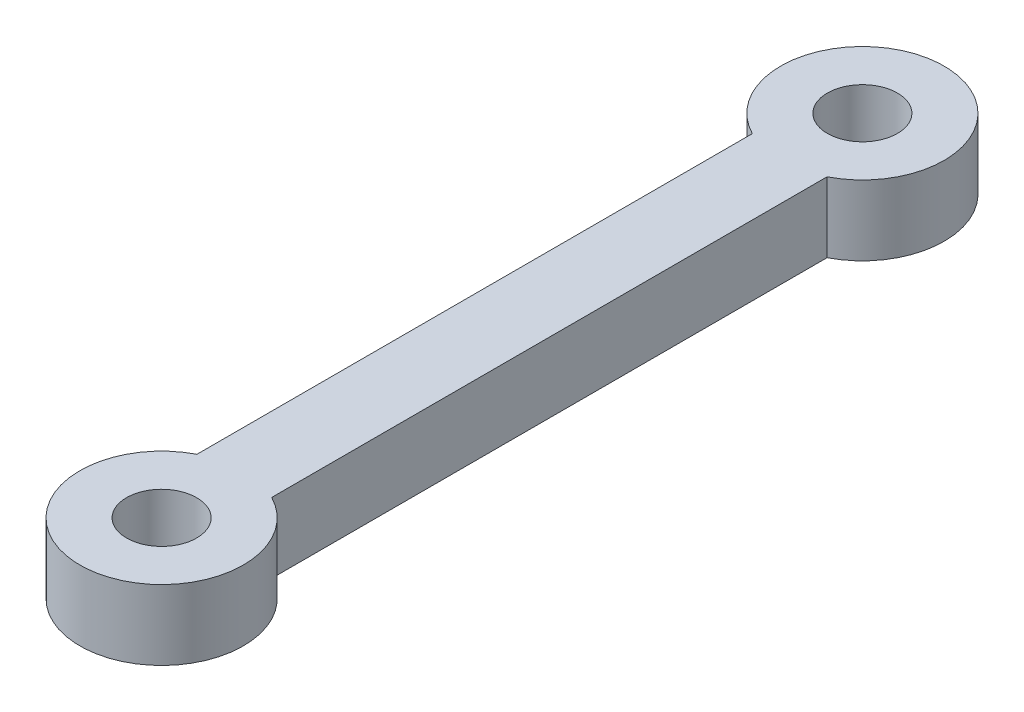
ISO-10303-21;
HEADER;
FILE_DESCRIPTION(('STEP AP214'),'2;1');
FILE_NAME('part.step','',(''),(''),'','','');
FILE_SCHEMA(('AUTOMOTIVE_DESIGN { 1 0 10303 214 1 1 1 1 }'));
ENDSEC;
DATA;
#1=APPLICATION_CONTEXT('core data for automotive mechanical design processes');
#2=APPLICATION_PROTOCOL_DEFINITION('international standard','automotive_design',2000,#1);
#3=PRODUCT_CONTEXT('',#1,'mechanical');
#4=PRODUCT('Part','Part','',(#3));
#5=PRODUCT_RELATED_PRODUCT_CATEGORY('part','',(#4));
#6=PRODUCT_DEFINITION_FORMATION('','',#4);
#7=PRODUCT_DEFINITION_CONTEXT('part definition',#1,'design');
#8=PRODUCT_DEFINITION('design','',#6,#7);
#9=PRODUCT_DEFINITION_SHAPE('','',#8);
#10=(LENGTH_UNIT() NAMED_UNIT(*) SI_UNIT(.MILLI.,.METRE.));
#11=(NAMED_UNIT(*) PLANE_ANGLE_UNIT() SI_UNIT($,.RADIAN.));
#12=(NAMED_UNIT(*) SI_UNIT($,.STERADIAN.) SOLID_ANGLE_UNIT());
#13=UNCERTAINTY_MEASURE_WITH_UNIT(LENGTH_MEASURE(1.E-05),#10,'distance_accuracy_value','');
#14=(GEOMETRIC_REPRESENTATION_CONTEXT(3) GLOBAL_UNCERTAINTY_ASSIGNED_CONTEXT((#13)) GLOBAL_UNIT_ASSIGNED_CONTEXT((#10,
#11,#12)) REPRESENTATION_CONTEXT('',''));
#15=CARTESIAN_POINT('',(0.,0.,0.));
#16=DIRECTION('',(0.,0.,1.));
#17=DIRECTION('',(1.,0.,0.));
#18=AXIS2_PLACEMENT_3D('',#15,#16,#17);
#19=CARTESIAN_POINT('',(0.,3.,0.));
#20=DIRECTION('',(0.,-1.,0.));
#21=DIRECTION('',(0.,0.,-1.));
#22=AXIS2_PLACEMENT_3D('',#19,#20,#21);
#23=CYLINDRICAL_SURFACE('',#22,3.5);
#24=CARTESIAN_POINT('',(0.,0.,0.));
#25=DIRECTION('',(0.,1.,0.));
#26=DIRECTION('',(0.,0.,1.));
#27=AXIS2_PLACEMENT_3D('',#24,#25,#26);
#28=CIRCLE('',#27,3.5);
#29=CARTESIAN_POINT('',(1.6,0.,-3.11287648325468));
#30=VERTEX_POINT('',#29);
#31=CARTESIAN_POINT('',(-1.6,0.,-3.11287648325468));
#32=VERTEX_POINT('',#31);
#33=EDGE_CURVE('E104',#30,#32,#28,.F.);
#34=ORIENTED_EDGE('',*,*,#33,.F.);
#35=DIRECTION('',(0.,-1.,0.));
#36=VECTOR('',#35,1.);
#37=CARTESIAN_POINT('',(1.6,3.,-3.11287648325468));
#38=LINE('',#37,#36);
#39=CARTESIAN_POINT('',(1.6,3.,-3.11287648325468));
#40=VERTEX_POINT('',#39);
#41=EDGE_CURVE('E11',#40,#30,#38,.T.);
#42=ORIENTED_EDGE('',*,*,#41,.F.);
#43=CARTESIAN_POINT('',(0.,3.,0.));
#44=DIRECTION('',(0.,1.,0.));
#45=DIRECTION('',(0.,0.,1.));
#46=AXIS2_PLACEMENT_3D('',#43,#44,#45);
#47=CIRCLE('',#46,3.5);
#48=CARTESIAN_POINT('',(-1.6,3.,-3.11287648325468));
#49=VERTEX_POINT('',#48);
#50=EDGE_CURVE('E90',#40,#49,#47,.F.);
#51=ORIENTED_EDGE('',*,*,#50,.T.);
#52=DIRECTION('',(0.,-1.,0.));
#53=VECTOR('',#52,1.);
#54=CARTESIAN_POINT('',(-1.6,3.,-3.11287648325468));
#55=LINE('',#54,#53);
#56=EDGE_CURVE('E50',#49,#32,#55,.T.);
#57=ORIENTED_EDGE('',*,*,#56,.T.);
#58=EDGE_LOOP('',(#34,#42,#51,#57));
#59=FACE_BOUND('',#58,.T.);
#60=ADVANCED_FACE('F34',(#59),#23,.T.);
#61=CARTESIAN_POINT('',(1.6,3.,0.));
#62=DIRECTION('',(1.,0.,0.));
#63=DIRECTION('',(0.,0.,-1.));
#64=AXIS2_PLACEMENT_3D('',#61,#62,#63);
#65=PLANE('',#64);
#66=DIRECTION('',(0.,0.,1.));
#67=VECTOR('',#66,1.);
#68=CARTESIAN_POINT('',(1.6,0.,0.));
#69=LINE('',#68,#67);
#70=CARTESIAN_POINT('',(1.6,0.,-26.8871235167453));
#71=VERTEX_POINT('',#70);
#72=EDGE_CURVE('E80',#71,#30,#69,.T.);
#73=ORIENTED_EDGE('',*,*,#72,.F.);
#74=DIRECTION('',(0.,-1.,0.));
#75=VECTOR('',#74,1.);
#76=CARTESIAN_POINT('',(1.6,3.,-26.8871235167453));
#77=LINE('',#76,#75);
#78=CARTESIAN_POINT('',(1.6,3.,-26.8871235167453));
#79=VERTEX_POINT('',#78);
#80=EDGE_CURVE('E42',#79,#71,#77,.T.);
#81=ORIENTED_EDGE('',*,*,#80,.F.);
#82=DIRECTION('',(0.,0.,1.));
#83=VECTOR('',#82,1.);
#84=CARTESIAN_POINT('',(1.6,3.,0.));
#85=LINE('',#84,#83);
#86=EDGE_CURVE('E78',#79,#40,#85,.T.);
#87=ORIENTED_EDGE('',*,*,#86,.T.);
#88=ORIENTED_EDGE('',*,*,#41,.T.);
#89=EDGE_LOOP('',(#73,#81,#87,#88));
#90=FACE_BOUND('',#89,.T.);
#91=ADVANCED_FACE('F77',(#90),#65,.T.);
#92=CARTESIAN_POINT('',(0.,3.,-30.));
#93=DIRECTION('',(0.,-1.,0.));
#94=DIRECTION('',(0.,0.,-1.));
#95=AXIS2_PLACEMENT_3D('',#92,#93,#94);
#96=CYLINDRICAL_SURFACE('',#95,3.5);
#97=CARTESIAN_POINT('',(0.,0.,-30.));
#98=DIRECTION('',(0.,1.,0.));
#99=DIRECTION('',(0.,0.,1.));
#100=AXIS2_PLACEMENT_3D('',#97,#98,#99);
#101=CIRCLE('',#100,3.5);
#102=CARTESIAN_POINT('',(-1.6,0.,-26.8871235167453));
#103=VERTEX_POINT('',#102);
#104=EDGE_CURVE('E107',#103,#71,#101,.F.);
#105=ORIENTED_EDGE('',*,*,#104,.F.);
#106=DIRECTION('',(0.,-1.,0.));
#107=VECTOR('',#106,1.);
#108=CARTESIAN_POINT('',(-1.6,3.,-26.8871235167453));
#109=LINE('',#108,#107);
#110=CARTESIAN_POINT('',(-1.6,3.,-26.8871235167453));
#111=VERTEX_POINT('',#110);
#112=EDGE_CURVE('E63',#111,#103,#109,.T.);
#113=ORIENTED_EDGE('',*,*,#112,.F.);
#114=CARTESIAN_POINT('',(0.,3.,-30.));
#115=DIRECTION('',(0.,1.,0.));
#116=DIRECTION('',(0.,0.,1.));
#117=AXIS2_PLACEMENT_3D('',#114,#115,#116);
#118=CIRCLE('',#117,3.5);
#119=EDGE_CURVE('E89',#111,#79,#118,.F.);
#120=ORIENTED_EDGE('',*,*,#119,.T.);
#121=ORIENTED_EDGE('',*,*,#80,.T.);
#122=EDGE_LOOP('',(#105,#113,#120,#121));
#123=FACE_BOUND('',#122,.T.);
#124=ADVANCED_FACE('F92',(#123),#96,.T.);
#125=CARTESIAN_POINT('',(0.,3.,-30.));
#126=DIRECTION('',(0.,-1.,0.));
#127=DIRECTION('',(0.,0.,-1.));
#128=AXIS2_PLACEMENT_3D('',#125,#126,#127);
#129=CYLINDRICAL_SURFACE('',#128,1.5);
#130=CARTESIAN_POINT('',(0.,3.,-30.));
#131=DIRECTION('',(0.,1.,0.));
#132=DIRECTION('',(0.,0.,1.));
#133=AXIS2_PLACEMENT_3D('',#130,#131,#132);
#134=CIRCLE('',#133,1.5);
#135=CARTESIAN_POINT('',(0.,3.,-28.5));
#136=VERTEX_POINT('',#135);
#137=EDGE_CURVE('E95',#136,#136,#134,.T.);
#138=ORIENTED_EDGE('',*,*,#137,.T.);
#139=EDGE_LOOP('',(#138));
#140=FACE_BOUND('',#139,.T.);
#141=CARTESIAN_POINT('',(0.,0.,-30.));
#142=DIRECTION('',(0.,1.,0.));
#143=DIRECTION('',(0.,0.,1.));
#144=AXIS2_PLACEMENT_3D('',#141,#142,#143);
#145=CIRCLE('',#144,1.5);
#146=CARTESIAN_POINT('',(0.,0.,-28.5));
#147=VERTEX_POINT('',#146);
#148=EDGE_CURVE('E112',#147,#147,#145,.T.);
#149=ORIENTED_EDGE('',*,*,#148,.F.);
#150=EDGE_LOOP('',(#149));
#151=FACE_BOUND('',#150,.T.);
#152=ADVANCED_FACE('F124',(#140,#151),#129,.F.);
#153=CARTESIAN_POINT('',(-1.6,3.,0.));
#154=DIRECTION('',(-1.,0.,0.));
#155=DIRECTION('',(0.,0.,1.));
#156=AXIS2_PLACEMENT_3D('',#153,#154,#155);
#157=PLANE('',#156);
#158=DIRECTION('',(0.,0.,-1.));
#159=VECTOR('',#158,1.);
#160=CARTESIAN_POINT('',(-1.6,0.,0.));
#161=LINE('',#160,#159);
#162=EDGE_CURVE('E109',#32,#103,#161,.T.);
#163=ORIENTED_EDGE('',*,*,#162,.F.);
#164=ORIENTED_EDGE('',*,*,#56,.F.);
#165=DIRECTION('',(0.,0.,-1.));
#166=VECTOR('',#165,1.);
#167=CARTESIAN_POINT('',(-1.6,3.,0.));
#168=LINE('',#167,#166);
#169=EDGE_CURVE('E93',#49,#111,#168,.T.);
#170=ORIENTED_EDGE('',*,*,#169,.T.);
#171=ORIENTED_EDGE('',*,*,#112,.T.);
#172=EDGE_LOOP('',(#163,#164,#170,#171));
#173=FACE_BOUND('',#172,.T.);
#174=ADVANCED_FACE('F121',(#173),#157,.T.);
#175=CARTESIAN_POINT('',(0.,3.,0.));
#176=DIRECTION('',(0.,-1.,0.));
#177=DIRECTION('',(0.,0.,-1.));
#178=AXIS2_PLACEMENT_3D('',#175,#176,#177);
#179=CYLINDRICAL_SURFACE('',#178,1.5);
#180=CARTESIAN_POINT('',(0.,3.,0.));
#181=DIRECTION('',(0.,1.,0.));
#182=DIRECTION('',(0.,0.,1.));
#183=AXIS2_PLACEMENT_3D('',#180,#181,#182);
#184=CIRCLE('',#183,1.5);
#185=CARTESIAN_POINT('',(0.,3.,1.5));
#186=VERTEX_POINT('',#185);
#187=EDGE_CURVE('E101',#186,#186,#184,.T.);
#188=ORIENTED_EDGE('',*,*,#187,.T.);
#189=EDGE_LOOP('',(#188));
#190=FACE_BOUND('',#189,.T.);
#191=CARTESIAN_POINT('',(0.,0.,0.));
#192=DIRECTION('',(0.,1.,0.));
#193=DIRECTION('',(0.,0.,1.));
#194=AXIS2_PLACEMENT_3D('',#191,#192,#193);
#195=CIRCLE('',#194,1.5);
#196=CARTESIAN_POINT('',(0.,0.,1.5));
#197=VERTEX_POINT('',#196);
#198=EDGE_CURVE('E115',#197,#197,#195,.T.);
#199=ORIENTED_EDGE('',*,*,#198,.F.);
#200=EDGE_LOOP('',(#199));
#201=FACE_BOUND('',#200,.T.);
#202=ADVANCED_FACE('F123',(#190,#201),#179,.F.);
#203=CARTESIAN_POINT('',(0.,3.,0.));
#204=DIRECTION('',(0.,1.,0.));
#205=DIRECTION('',(0.,0.,1.));
#206=AXIS2_PLACEMENT_3D('',#203,#204,#205);
#207=PLANE('',#206);
#208=ORIENTED_EDGE('',*,*,#50,.F.);
#209=ORIENTED_EDGE('',*,*,#86,.F.);
#210=ORIENTED_EDGE('',*,*,#119,.F.);
#211=ORIENTED_EDGE('',*,*,#169,.F.);
#212=EDGE_LOOP('',(#208,#209,#210,#211));
#213=FACE_BOUND('',#212,.T.);
#214=ORIENTED_EDGE('',*,*,#137,.F.);
#215=EDGE_LOOP('',(#214));
#216=FACE_BOUND('',#215,.T.);
#217=ORIENTED_EDGE('',*,*,#187,.F.);
#218=EDGE_LOOP('',(#217));
#219=FACE_BOUND('',#218,.T.);
#220=ADVANCED_FACE('F86',(#213,#216,#219),#207,.T.);
#221=CARTESIAN_POINT('',(0.,0.,0.));
#222=DIRECTION('',(0.,1.,0.));
#223=DIRECTION('',(0.,0.,1.));
#224=AXIS2_PLACEMENT_3D('',#221,#222,#223);
#225=PLANE('',#224);
#226=ORIENTED_EDGE('',*,*,#33,.T.);
#227=ORIENTED_EDGE('',*,*,#162,.T.);
#228=ORIENTED_EDGE('',*,*,#104,.T.);
#229=ORIENTED_EDGE('',*,*,#72,.T.);
#230=EDGE_LOOP('',(#226,#227,#228,#229));
#231=FACE_BOUND('',#230,.T.);
#232=ORIENTED_EDGE('',*,*,#148,.T.);
#233=EDGE_LOOP('',(#232));
#234=FACE_BOUND('',#233,.T.);
#235=ORIENTED_EDGE('',*,*,#198,.T.);
#236=EDGE_LOOP('',(#235));
#237=FACE_BOUND('',#236,.T.);
#238=ADVANCED_FACE('F167',(#231,#234,#237),#225,.F.);
#239=CLOSED_SHELL('',(#60,#91,#124,#152,#174,#202,#220,#238));
#240=MANIFOLD_SOLID_BREP('B2',#239);
#241=ADVANCED_BREP_SHAPE_REPRESENTATION('',(#18,#240),#14);
#242=SHAPE_DEFINITION_REPRESENTATION(#9,#241);
ENDSEC;
END-ISO-10303-21;
